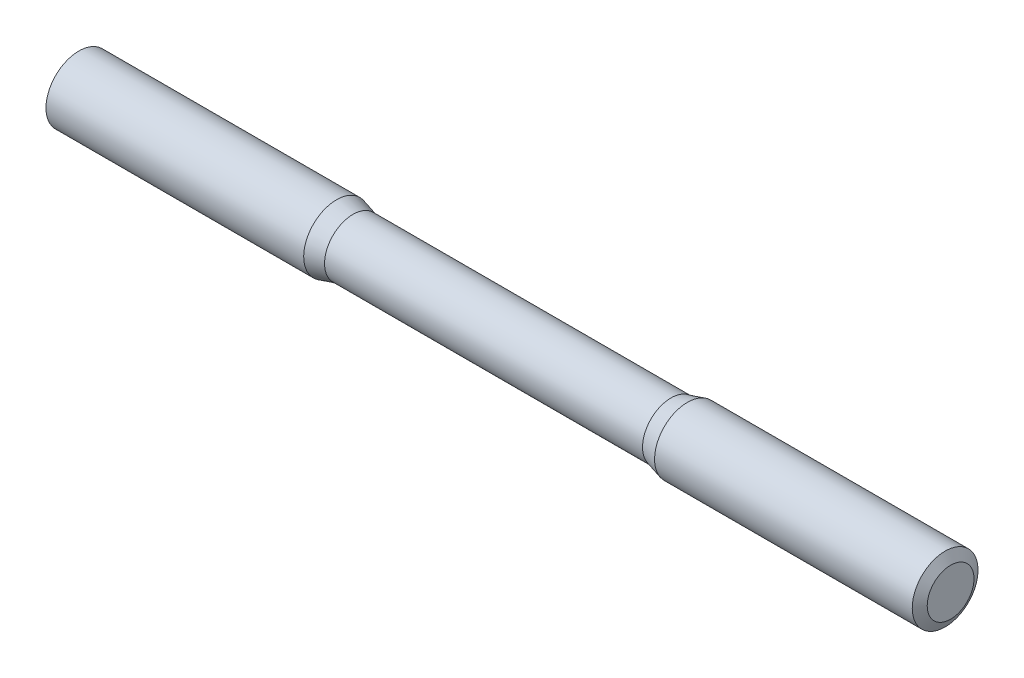
ISO-10303-21;
HEADER;
FILE_DESCRIPTION(('STEP AP214'),'2;1');
FILE_NAME('part.step','',(''),(''),'','','');
FILE_SCHEMA(('AUTOMOTIVE_DESIGN { 1 0 10303 214 1 1 1 1 }'));
ENDSEC;
DATA;
#1=APPLICATION_CONTEXT('core data for automotive mechanical design processes');
#2=APPLICATION_PROTOCOL_DEFINITION('international standard','automotive_design',2000,#1);
#3=PRODUCT_CONTEXT('',#1,'mechanical');
#4=PRODUCT('Part','Part','',(#3));
#5=PRODUCT_RELATED_PRODUCT_CATEGORY('part','',(#4));
#6=PRODUCT_DEFINITION_FORMATION('','',#4);
#7=PRODUCT_DEFINITION_CONTEXT('part definition',#1,'design');
#8=PRODUCT_DEFINITION('design','',#6,#7);
#9=PRODUCT_DEFINITION_SHAPE('','',#8);
#10=(LENGTH_UNIT() NAMED_UNIT(*) SI_UNIT(.MILLI.,.METRE.));
#11=(NAMED_UNIT(*) PLANE_ANGLE_UNIT() SI_UNIT($,.RADIAN.));
#12=(NAMED_UNIT(*) SI_UNIT($,.STERADIAN.) SOLID_ANGLE_UNIT());
#13=UNCERTAINTY_MEASURE_WITH_UNIT(LENGTH_MEASURE(1.E-05),#10,'distance_accuracy_value','');
#14=(GEOMETRIC_REPRESENTATION_CONTEXT(3) GLOBAL_UNCERTAINTY_ASSIGNED_CONTEXT((#13)) GLOBAL_UNIT_ASSIGNED_CONTEXT((#10,
#11,#12)) REPRESENTATION_CONTEXT('',''));
#15=CARTESIAN_POINT('',(0.,0.,0.));
#16=DIRECTION('',(0.,0.,1.));
#17=DIRECTION('',(1.,0.,0.));
#18=AXIS2_PLACEMENT_3D('',#15,#16,#17);
#19=CARTESIAN_POINT('',(-20.,0.,0.));
#20=DIRECTION('',(-1.,0.,0.));
#21=DIRECTION('',(0.,-1.,0.));
#22=AXIS2_PLACEMENT_3D('',#19,#20,#21);
#23=CYLINDRICAL_SURFACE('',#22,1.5);
#24=CARTESIAN_POINT('',(8.,0.,0.));
#25=DIRECTION('',(-1.,0.,0.));
#26=DIRECTION('',(0.,-1.,0.));
#27=AXIS2_PLACEMENT_3D('',#24,#25,#26);
#28=CIRCLE('',#27,1.5);
#29=CARTESIAN_POINT('',(8.,-1.5,0.));
#30=VERTEX_POINT('',#29);
#31=EDGE_CURVE('E10',#30,#30,#28,.T.);
#32=ORIENTED_EDGE('',*,*,#31,.F.);
#33=EDGE_LOOP('',(#32));
#34=FACE_BOUND('',#33,.T.);
#35=CARTESIAN_POINT('',(19.7500073334409,0.,0.));
#36=DIRECTION('',(-1.,0.,0.));
#37=DIRECTION('',(0.,0.,1.));
#38=AXIS2_PLACEMENT_3D('',#35,#36,#37);
#39=CIRCLE('',#38,1.5);
#40=CARTESIAN_POINT('',(19.7500073334409,0.,1.5));
#41=VERTEX_POINT('',#40);
#42=EDGE_CURVE('E61',#41,#41,#39,.T.);
#43=ORIENTED_EDGE('',*,*,#42,.T.);
#44=EDGE_LOOP('',(#43));
#45=FACE_BOUND('',#44,.T.);
#46=ADVANCED_FACE('F35',(#34,#45),#23,.T.);
#47=CARTESIAN_POINT('',(-20.,0.,0.));
#48=DIRECTION('',(-1.,0.,0.));
#49=DIRECTION('',(0.,-1.,0.));
#50=AXIS2_PLACEMENT_3D('',#47,#48,#49);
#51=CYLINDRICAL_SURFACE('',#50,1.5);
#52=CARTESIAN_POINT('',(-8.,0.,0.));
#53=DIRECTION('',(-1.,0.,0.));
#54=DIRECTION('',(0.,-1.,0.));
#55=AXIS2_PLACEMENT_3D('',#52,#53,#54);
#56=CIRCLE('',#55,1.5);
#57=CARTESIAN_POINT('',(-8.,-1.5,0.));
#58=VERTEX_POINT('',#57);
#59=EDGE_CURVE('E50',#58,#58,#56,.T.);
#60=ORIENTED_EDGE('',*,*,#59,.T.);
#61=EDGE_LOOP('',(#60));
#62=FACE_BOUND('',#61,.T.);
#63=CARTESIAN_POINT('',(-19.7500073334409,0.,0.));
#64=DIRECTION('',(-1.,0.,0.));
#65=DIRECTION('',(0.,0.,1.));
#66=AXIS2_PLACEMENT_3D('',#63,#64,#65);
#67=CIRCLE('',#66,1.5);
#68=CARTESIAN_POINT('',(-19.7500073334409,0.,1.5));
#69=VERTEX_POINT('',#68);
#70=EDGE_CURVE('E58',#69,#69,#67,.T.);
#71=ORIENTED_EDGE('',*,*,#70,.F.);
#72=EDGE_LOOP('',(#71));
#73=FACE_BOUND('',#72,.T.);
#74=ADVANCED_FACE('F79',(#62,#73),#51,.T.);
#75=CARTESIAN_POINT('',(8.,0.,0.));
#76=DIRECTION('',(1.,0.,0.));
#77=DIRECTION('',(0.,1.,0.));
#78=AXIS2_PLACEMENT_3D('',#75,#76,#77);
#79=CONICAL_SURFACE('',#78,1.5,0.261846791304115);
#80=CARTESIAN_POINT('',(7.25,0.,0.));
#81=DIRECTION('',(-1.,0.,0.));
#82=DIRECTION('',(0.,-1.,0.));
#83=AXIS2_PLACEMENT_3D('',#80,#81,#82);
#84=CIRCLE('',#83,1.299);
#85=CARTESIAN_POINT('',(7.25,-1.299,0.));
#86=VERTEX_POINT('',#85);
#87=EDGE_CURVE('E42',#86,#86,#84,.T.);
#88=ORIENTED_EDGE('',*,*,#87,.F.);
#89=EDGE_LOOP('',(#88));
#90=FACE_BOUND('',#89,.T.);
#91=ORIENTED_EDGE('',*,*,#31,.T.);
#92=EDGE_LOOP('',(#91));
#93=FACE_BOUND('',#92,.T.);
#94=ADVANCED_FACE('F84',(#90,#93),#79,.T.);
#95=CARTESIAN_POINT('',(-20.,0.,0.));
#96=DIRECTION('',(-1.,0.,0.));
#97=DIRECTION('',(0.,-1.,0.));
#98=AXIS2_PLACEMENT_3D('',#95,#96,#97);
#99=CYLINDRICAL_SURFACE('',#98,1.299);
#100=CARTESIAN_POINT('',(-7.25,0.,0.));
#101=DIRECTION('',(-1.,0.,0.));
#102=DIRECTION('',(0.,-1.,0.));
#103=AXIS2_PLACEMENT_3D('',#100,#101,#102);
#104=CIRCLE('',#103,1.299);
#105=CARTESIAN_POINT('',(-7.25,-1.299,0.));
#106=VERTEX_POINT('',#105);
#107=EDGE_CURVE('E46',#106,#106,#104,.T.);
#108=ORIENTED_EDGE('',*,*,#107,.F.);
#109=EDGE_LOOP('',(#108));
#110=FACE_BOUND('',#109,.T.);
#111=ORIENTED_EDGE('',*,*,#87,.T.);
#112=EDGE_LOOP('',(#111));
#113=FACE_BOUND('',#112,.T.);
#114=ADVANCED_FACE('F91',(#110,#113),#99,.T.);
#115=CARTESIAN_POINT('',(-7.25,0.,0.));
#116=DIRECTION('',(-1.,0.,0.));
#117=DIRECTION('',(0.,-1.,0.));
#118=AXIS2_PLACEMENT_3D('',#115,#116,#117);
#119=CONICAL_SURFACE('',#118,1.299,0.261846791304115);
#120=ORIENTED_EDGE('',*,*,#59,.F.);
#121=EDGE_LOOP('',(#120));
#122=FACE_BOUND('',#121,.T.);
#123=ORIENTED_EDGE('',*,*,#107,.T.);
#124=EDGE_LOOP('',(#123));
#125=FACE_BOUND('',#124,.T.);
#126=ADVANCED_FACE('F95',(#122,#125),#119,.T.);
#127=CARTESIAN_POINT('',(-20.,0.,0.));
#128=DIRECTION('',(1.,0.,0.));
#129=DIRECTION('',(0.,0.,-1.));
#130=AXIS2_PLACEMENT_3D('',#127,#128,#129);
#131=CONICAL_SURFACE('',#130,1.067,1.04719755119659);
#132=ORIENTED_EDGE('',*,*,#70,.T.);
#133=EDGE_LOOP('',(#132));
#134=FACE_BOUND('',#133,.T.);
#135=CARTESIAN_POINT('',(-20.,0.,0.));
#136=DIRECTION('',(-1.,0.,0.));
#137=DIRECTION('',(0.,0.,1.));
#138=AXIS2_PLACEMENT_3D('',#135,#136,#137);
#139=CIRCLE('',#138,1.067);
#140=CARTESIAN_POINT('',(-20.,0.,1.067));
#141=VERTEX_POINT('',#140);
#142=EDGE_CURVE('E55',#141,#141,#139,.T.);
#143=ORIENTED_EDGE('',*,*,#142,.F.);
#144=EDGE_LOOP('',(#143));
#145=FACE_BOUND('',#144,.T.);
#146=ADVANCED_FACE('F98',(#134,#145),#131,.T.);
#147=CARTESIAN_POINT('',(-20.,1.5,0.));
#148=DIRECTION('',(1.,0.,0.));
#149=DIRECTION('',(0.,1.,0.));
#150=AXIS2_PLACEMENT_3D('',#147,#148,#149);
#151=PLANE('',#150);
#152=ORIENTED_EDGE('',*,*,#142,.T.);
#153=EDGE_LOOP('',(#152));
#154=FACE_BOUND('',#153,.T.);
#155=ADVANCED_FACE('F37',(#154),#151,.F.);
#156=CARTESIAN_POINT('',(20.,0.,0.));
#157=DIRECTION('',(-1.,0.,0.));
#158=DIRECTION('',(0.,0.,-1.));
#159=AXIS2_PLACEMENT_3D('',#156,#157,#158);
#160=CONICAL_SURFACE('',#159,1.067,1.04719755119659);
#161=ORIENTED_EDGE('',*,*,#42,.F.);
#162=EDGE_LOOP('',(#161));
#163=FACE_BOUND('',#162,.T.);
#164=CARTESIAN_POINT('',(20.,0.,0.));
#165=DIRECTION('',(-1.,0.,0.));
#166=DIRECTION('',(0.,0.,1.));
#167=AXIS2_PLACEMENT_3D('',#164,#165,#166);
#168=CIRCLE('',#167,1.067);
#169=CARTESIAN_POINT('',(20.,0.,1.067));
#170=VERTEX_POINT('',#169);
#171=EDGE_CURVE('E64',#170,#170,#168,.T.);
#172=ORIENTED_EDGE('',*,*,#171,.T.);
#173=EDGE_LOOP('',(#172));
#174=FACE_BOUND('',#173,.T.);
#175=ADVANCED_FACE('F68',(#163,#174),#160,.T.);
#176=CARTESIAN_POINT('',(20.,1.5,0.));
#177=DIRECTION('',(-1.,0.,0.));
#178=DIRECTION('',(0.,-1.,0.));
#179=AXIS2_PLACEMENT_3D('',#176,#177,#178);
#180=PLANE('',#179);
#181=ORIENTED_EDGE('',*,*,#171,.F.);
#182=EDGE_LOOP('',(#181));
#183=FACE_BOUND('',#182,.T.);
#184=ADVANCED_FACE('F70',(#183),#180,.F.);
#185=CLOSED_SHELL('',(#46,#74,#94,#114,#126,#146,#155,#175,#184));
#186=MANIFOLD_SOLID_BREP('B2',#185);
#187=ADVANCED_BREP_SHAPE_REPRESENTATION('',(#18,#186),#14);
#188=SHAPE_DEFINITION_REPRESENTATION(#9,#187);
ENDSEC;
END-ISO-10303-21;
